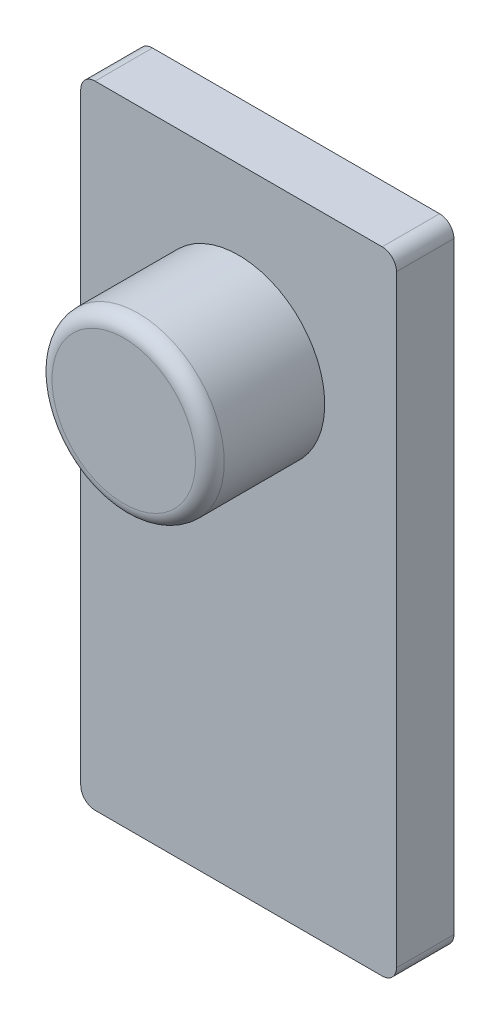
ISO-10303-21;
HEADER;
FILE_DESCRIPTION(('STEP AP214'),'2;1');
FILE_NAME('part.step','',(''),(''),'','','');
FILE_SCHEMA(('AUTOMOTIVE_DESIGN { 1 0 10303 214 1 1 1 1 }'));
ENDSEC;
DATA;
#1=APPLICATION_CONTEXT('core data for automotive mechanical design processes');
#2=APPLICATION_PROTOCOL_DEFINITION('international standard','automotive_design',2000,#1);
#3=PRODUCT_CONTEXT('',#1,'mechanical');
#4=PRODUCT('Part','Part','',(#3));
#5=PRODUCT_RELATED_PRODUCT_CATEGORY('part','',(#4));
#6=PRODUCT_DEFINITION_FORMATION('','',#4);
#7=PRODUCT_DEFINITION_CONTEXT('part definition',#1,'design');
#8=PRODUCT_DEFINITION('design','',#6,#7);
#9=PRODUCT_DEFINITION_SHAPE('','',#8);
#10=(LENGTH_UNIT() NAMED_UNIT(*) SI_UNIT(.MILLI.,.METRE.));
#11=(NAMED_UNIT(*) PLANE_ANGLE_UNIT() SI_UNIT($,.RADIAN.));
#12=(NAMED_UNIT(*) SI_UNIT($,.STERADIAN.) SOLID_ANGLE_UNIT());
#13=UNCERTAINTY_MEASURE_WITH_UNIT(LENGTH_MEASURE(1.E-05),#10,'distance_accuracy_value','');
#14=(GEOMETRIC_REPRESENTATION_CONTEXT(3) GLOBAL_UNCERTAINTY_ASSIGNED_CONTEXT((#13)) GLOBAL_UNIT_ASSIGNED_CONTEXT((#10,
#11,#12)) REPRESENTATION_CONTEXT('',''));
#15=CARTESIAN_POINT('',(0.,0.,0.));
#16=DIRECTION('',(0.,0.,1.));
#17=DIRECTION('',(1.,0.,0.));
#18=AXIS2_PLACEMENT_3D('',#15,#16,#17);
#19=CARTESIAN_POINT('',(-11.5,-11.,2.));
#20=DIRECTION('',(1.,0.,0.));
#21=DIRECTION('',(0.,0.,-1.));
#22=AXIS2_PLACEMENT_3D('',#19,#20,#21);
#23=PLANE('',#22);
#24=DIRECTION('',(0.,-1.,0.));
#25=VECTOR('',#24,1.);
#26=CARTESIAN_POINT('',(-11.5,-11.,0.));
#27=LINE('',#26,#25);
#28=CARTESIAN_POINT('',(-11.5,10.5,0.));
#29=VERTEX_POINT('',#28);
#30=CARTESIAN_POINT('',(-11.5,-10.5,0.));
#31=VERTEX_POINT('',#30);
#32=EDGE_CURVE('E146',#29,#31,#27,.T.);
#33=ORIENTED_EDGE('',*,*,#32,.T.);
#34=DIRECTION('',(0.,0.,-1.));
#35=VECTOR('',#34,1.);
#36=CARTESIAN_POINT('',(-11.5,-10.5,2.));
#37=LINE('',#36,#35);
#38=CARTESIAN_POINT('',(-11.5,-10.5,2.));
#39=VERTEX_POINT('',#38);
#40=EDGE_CURVE('E191',#31,#39,#37,.F.);
#41=ORIENTED_EDGE('',*,*,#40,.T.);
#42=DIRECTION('',(0.,-1.,0.));
#43=VECTOR('',#42,1.);
#44=CARTESIAN_POINT('',(-11.5,-11.,2.));
#45=LINE('',#44,#43);
#46=CARTESIAN_POINT('',(-11.5,10.5,2.));
#47=VERTEX_POINT('',#46);
#48=EDGE_CURVE('E144',#47,#39,#45,.T.);
#49=ORIENTED_EDGE('',*,*,#48,.F.);
#50=DIRECTION('',(0.,0.,-1.));
#51=VECTOR('',#50,1.);
#52=CARTESIAN_POINT('',(-11.5,10.5,2.));
#53=LINE('',#52,#51);
#54=EDGE_CURVE('E187',#47,#29,#53,.T.);
#55=ORIENTED_EDGE('',*,*,#54,.T.);
#56=EDGE_LOOP('',(#33,#41,#49,#55));
#57=FACE_BOUND('',#56,.T.);
#58=ADVANCED_FACE('F43',(#57),#23,.F.);
#59=CARTESIAN_POINT('',(-11.5,-11.,2.));
#60=DIRECTION('',(0.,1.,0.));
#61=DIRECTION('',(0.,0.,1.));
#62=AXIS2_PLACEMENT_3D('',#59,#60,#61);
#63=PLANE('',#62);
#64=DIRECTION('',(1.,0.,0.));
#65=VECTOR('',#64,1.);
#66=CARTESIAN_POINT('',(-11.5,-11.,0.));
#67=LINE('',#66,#65);
#68=CARTESIAN_POINT('',(-11.,-11.,0.));
#69=VERTEX_POINT('',#68);
#70=CARTESIAN_POINT('',(-1.,-11.,0.));
#71=VERTEX_POINT('',#70);
#72=EDGE_CURVE('E140',#69,#71,#67,.T.);
#73=ORIENTED_EDGE('',*,*,#72,.T.);
#74=DIRECTION('',(0.,0.,-1.));
#75=VECTOR('',#74,1.);
#76=CARTESIAN_POINT('',(-1.,-11.,2.));
#77=LINE('',#76,#75);
#78=CARTESIAN_POINT('',(-1.,-11.,2.));
#79=VERTEX_POINT('',#78);
#80=EDGE_CURVE('E115',#71,#79,#77,.F.);
#81=ORIENTED_EDGE('',*,*,#80,.T.);
#82=DIRECTION('',(1.,0.,0.));
#83=VECTOR('',#82,1.);
#84=CARTESIAN_POINT('',(-11.5,-11.,2.));
#85=LINE('',#84,#83);
#86=CARTESIAN_POINT('',(-11.,-11.,2.));
#87=VERTEX_POINT('',#86);
#88=EDGE_CURVE('E198',#87,#79,#85,.T.);
#89=ORIENTED_EDGE('',*,*,#88,.F.);
#90=DIRECTION('',(0.,0.,-1.));
#91=VECTOR('',#90,1.);
#92=CARTESIAN_POINT('',(-11.,-11.,2.));
#93=LINE('',#92,#91);
#94=EDGE_CURVE('E121',#87,#69,#93,.T.);
#95=ORIENTED_EDGE('',*,*,#94,.T.);
#96=EDGE_LOOP('',(#73,#81,#89,#95));
#97=FACE_BOUND('',#96,.T.);
#98=ADVANCED_FACE('F219',(#97),#63,.F.);
#99=CARTESIAN_POINT('',(-0.5,-11.,2.));
#100=DIRECTION('',(-1.,0.,0.));
#101=DIRECTION('',(0.,0.,1.));
#102=AXIS2_PLACEMENT_3D('',#99,#100,#101);
#103=PLANE('',#102);
#104=DIRECTION('',(0.,1.,0.));
#105=VECTOR('',#104,1.);
#106=CARTESIAN_POINT('',(-0.5,-11.,2.));
#107=LINE('',#106,#105);
#108=CARTESIAN_POINT('',(-0.5,-10.5,2.));
#109=VERTEX_POINT('',#108);
#110=CARTESIAN_POINT('',(-0.5,10.5,2.));
#111=VERTEX_POINT('',#110);
#112=EDGE_CURVE('E130',#109,#111,#107,.T.);
#113=ORIENTED_EDGE('',*,*,#112,.F.);
#114=DIRECTION('',(0.,0.,-1.));
#115=VECTOR('',#114,1.);
#116=CARTESIAN_POINT('',(-0.5,-10.5,2.));
#117=LINE('',#116,#115);
#118=CARTESIAN_POINT('',(-0.5,-10.5,0.));
#119=VERTEX_POINT('',#118);
#120=EDGE_CURVE('E114',#109,#119,#117,.T.);
#121=ORIENTED_EDGE('',*,*,#120,.T.);
#122=DIRECTION('',(0.,1.,0.));
#123=VECTOR('',#122,1.);
#124=CARTESIAN_POINT('',(-0.5,-11.,0.));
#125=LINE('',#124,#123);
#126=CARTESIAN_POINT('',(-0.5,10.5,0.));
#127=VERTEX_POINT('',#126);
#128=EDGE_CURVE('E128',#119,#127,#125,.T.);
#129=ORIENTED_EDGE('',*,*,#128,.T.);
#130=DIRECTION('',(0.,0.,-1.));
#131=VECTOR('',#130,1.);
#132=CARTESIAN_POINT('',(-0.5,10.5,2.));
#133=LINE('',#132,#131);
#134=EDGE_CURVE('E133',#127,#111,#133,.F.);
#135=ORIENTED_EDGE('',*,*,#134,.T.);
#136=EDGE_LOOP('',(#113,#121,#129,#135));
#137=FACE_BOUND('',#136,.T.);
#138=ADVANCED_FACE('F127',(#137),#103,.F.);
#139=CARTESIAN_POINT('',(-11.5,11.,2.));
#140=DIRECTION('',(0.,-1.,0.));
#141=DIRECTION('',(0.,0.,-1.));
#142=AXIS2_PLACEMENT_3D('',#139,#140,#141);
#143=PLANE('',#142);
#144=DIRECTION('',(-1.,0.,0.));
#145=VECTOR('',#144,1.);
#146=CARTESIAN_POINT('',(-11.5,11.,2.));
#147=LINE('',#146,#145);
#148=CARTESIAN_POINT('',(-1.,11.,2.));
#149=VERTEX_POINT('',#148);
#150=CARTESIAN_POINT('',(-11.,11.,2.));
#151=VERTEX_POINT('',#150);
#152=EDGE_CURVE('E155',#149,#151,#147,.T.);
#153=ORIENTED_EDGE('',*,*,#152,.F.);
#154=DIRECTION('',(0.,0.,-1.));
#155=VECTOR('',#154,1.);
#156=CARTESIAN_POINT('',(-1.,11.,2.));
#157=LINE('',#156,#155);
#158=CARTESIAN_POINT('',(-1.,11.,0.));
#159=VERTEX_POINT('',#158);
#160=EDGE_CURVE('E11',#149,#159,#157,.T.);
#161=ORIENTED_EDGE('',*,*,#160,.T.);
#162=DIRECTION('',(-1.,0.,0.));
#163=VECTOR('',#162,1.);
#164=CARTESIAN_POINT('',(-11.5,11.,0.));
#165=LINE('',#164,#163);
#166=CARTESIAN_POINT('',(-11.,11.,0.));
#167=VERTEX_POINT('',#166);
#168=EDGE_CURVE('E139',#159,#167,#165,.T.);
#169=ORIENTED_EDGE('',*,*,#168,.T.);
#170=DIRECTION('',(0.,0.,-1.));
#171=VECTOR('',#170,1.);
#172=CARTESIAN_POINT('',(-11.,11.,2.));
#173=LINE('',#172,#171);
#174=EDGE_CURVE('E52',#167,#151,#173,.F.);
#175=ORIENTED_EDGE('',*,*,#174,.T.);
#176=EDGE_LOOP('',(#153,#161,#169,#175));
#177=FACE_BOUND('',#176,.T.);
#178=ADVANCED_FACE('F226',(#177),#143,.F.);
#179=CARTESIAN_POINT('',(0.,0.,2.));
#180=DIRECTION('',(0.,0.,-1.));
#181=DIRECTION('',(-1.,0.,0.));
#182=AXIS2_PLACEMENT_3D('',#179,#180,#181);
#183=PLANE('',#182);
#184=CARTESIAN_POINT('',(-6.,5.25,2.));
#185=DIRECTION('',(0.,0.,-1.));
#186=DIRECTION('',(-1.,0.,0.));
#187=AXIS2_PLACEMENT_3D('',#184,#185,#186);
#188=CIRCLE('',#187,3.);
#189=CARTESIAN_POINT('',(-9.,5.25,2.));
#190=VERTEX_POINT('',#189);
#191=EDGE_CURVE('E150',#190,#190,#188,.F.);
#192=ORIENTED_EDGE('',*,*,#191,.F.);
#193=EDGE_LOOP('',(#192));
#194=FACE_BOUND('',#193,.T.);
#195=ORIENTED_EDGE('',*,*,#88,.T.);
#196=CARTESIAN_POINT('',(-1.,-10.5,2.));
#197=DIRECTION('',(0.,0.,-1.));
#198=DIRECTION('',(-1.,0.,0.));
#199=AXIS2_PLACEMENT_3D('',#196,#197,#198);
#200=CIRCLE('',#199,0.5);
#201=EDGE_CURVE('E184',#79,#109,#200,.F.);
#202=ORIENTED_EDGE('',*,*,#201,.T.);
#203=ORIENTED_EDGE('',*,*,#112,.T.);
#204=CARTESIAN_POINT('',(-1.,10.5,2.));
#205=DIRECTION('',(0.,0.,-1.));
#206=DIRECTION('',(-1.,0.,0.));
#207=AXIS2_PLACEMENT_3D('',#204,#205,#206);
#208=CIRCLE('',#207,0.5);
#209=EDGE_CURVE('E65',#111,#149,#208,.F.);
#210=ORIENTED_EDGE('',*,*,#209,.T.);
#211=ORIENTED_EDGE('',*,*,#152,.T.);
#212=CARTESIAN_POINT('',(-11.,10.5,2.));
#213=DIRECTION('',(0.,0.,-1.));
#214=DIRECTION('',(-1.,0.,0.));
#215=AXIS2_PLACEMENT_3D('',#212,#213,#214);
#216=CIRCLE('',#215,0.5);
#217=EDGE_CURVE('E176',#151,#47,#216,.F.);
#218=ORIENTED_EDGE('',*,*,#217,.T.);
#219=ORIENTED_EDGE('',*,*,#48,.T.);
#220=CARTESIAN_POINT('',(-11.,-10.5,2.));
#221=DIRECTION('',(0.,0.,-1.));
#222=DIRECTION('',(-1.,0.,0.));
#223=AXIS2_PLACEMENT_3D('',#220,#221,#222);
#224=CIRCLE('',#223,0.5);
#225=EDGE_CURVE('E181',#39,#87,#224,.F.);
#226=ORIENTED_EDGE('',*,*,#225,.T.);
#227=EDGE_LOOP('',(#195,#202,#203,#210,#211,#218,#219,#226));
#228=FACE_BOUND('',#227,.T.);
#229=ADVANCED_FACE('F217',(#194,#228),#183,.F.);
#230=CARTESIAN_POINT('',(0.,0.,0.));
#231=DIRECTION('',(0.,0.,-1.));
#232=DIRECTION('',(-1.,0.,0.));
#233=AXIS2_PLACEMENT_3D('',#230,#231,#232);
#234=PLANE('',#233);
#235=ORIENTED_EDGE('',*,*,#128,.F.);
#236=CARTESIAN_POINT('',(-1.,-10.5,0.));
#237=DIRECTION('',(0.,0.,-1.));
#238=DIRECTION('',(-1.,0.,0.));
#239=AXIS2_PLACEMENT_3D('',#236,#237,#238);
#240=CIRCLE('',#239,0.5);
#241=EDGE_CURVE('E110',#119,#71,#240,.T.);
#242=ORIENTED_EDGE('',*,*,#241,.T.);
#243=ORIENTED_EDGE('',*,*,#72,.F.);
#244=CARTESIAN_POINT('',(-11.,-10.5,0.));
#245=DIRECTION('',(0.,0.,-1.));
#246=DIRECTION('',(-1.,0.,0.));
#247=AXIS2_PLACEMENT_3D('',#244,#245,#246);
#248=CIRCLE('',#247,0.5);
#249=EDGE_CURVE('E122',#69,#31,#248,.T.);
#250=ORIENTED_EDGE('',*,*,#249,.T.);
#251=ORIENTED_EDGE('',*,*,#32,.F.);
#252=CARTESIAN_POINT('',(-11.,10.5,0.));
#253=DIRECTION('',(0.,0.,-1.));
#254=DIRECTION('',(-1.,0.,0.));
#255=AXIS2_PLACEMENT_3D('',#252,#253,#254);
#256=CIRCLE('',#255,0.5);
#257=EDGE_CURVE('E132',#29,#167,#256,.T.);
#258=ORIENTED_EDGE('',*,*,#257,.T.);
#259=ORIENTED_EDGE('',*,*,#168,.F.);
#260=CARTESIAN_POINT('',(-1.,10.5,0.));
#261=DIRECTION('',(0.,0.,-1.));
#262=DIRECTION('',(-1.,0.,0.));
#263=AXIS2_PLACEMENT_3D('',#260,#261,#262);
#264=CIRCLE('',#263,0.5);
#265=EDGE_CURVE('E137',#159,#127,#264,.T.);
#266=ORIENTED_EDGE('',*,*,#265,.T.);
#267=EDGE_LOOP('',(#235,#242,#243,#250,#251,#258,#259,#266));
#268=FACE_BOUND('',#267,.T.);
#269=ADVANCED_FACE('F135',(#268),#234,.T.);
#270=CARTESIAN_POINT('',(-6.,5.25,6.));
#271=DIRECTION('',(0.,0.,-1.));
#272=DIRECTION('',(-1.,0.,0.));
#273=AXIS2_PLACEMENT_3D('',#270,#271,#272);
#274=CYLINDRICAL_SURFACE('',#273,3.);
#275=CARTESIAN_POINT('',(-6.,5.25,5.5));
#276=DIRECTION('',(0.,0.,1.));
#277=DIRECTION('',(1.,0.,0.));
#278=AXIS2_PLACEMENT_3D('',#275,#276,#277);
#279=CIRCLE('',#278,3.);
#280=CARTESIAN_POINT('',(-3.,5.25,5.5));
#281=VERTEX_POINT('',#280);
#282=EDGE_CURVE('E159',#281,#281,#279,.F.);
#283=ORIENTED_EDGE('',*,*,#282,.T.);
#284=EDGE_LOOP('',(#283));
#285=FACE_BOUND('',#284,.T.);
#286=ORIENTED_EDGE('',*,*,#191,.T.);
#287=EDGE_LOOP('',(#286));
#288=FACE_BOUND('',#287,.T.);
#289=ADVANCED_FACE('F256',(#285,#288),#274,.T.);
#290=CARTESIAN_POINT('',(-6.,5.25,6.));
#291=DIRECTION('',(0.,0.,1.));
#292=DIRECTION('',(1.,0.,0.));
#293=AXIS2_PLACEMENT_3D('',#290,#291,#292);
#294=PLANE('',#293);
#295=CARTESIAN_POINT('',(-6.,5.25,6.));
#296=DIRECTION('',(0.,0.,1.));
#297=DIRECTION('',(1.,0.,0.));
#298=AXIS2_PLACEMENT_3D('',#295,#296,#297);
#299=CIRCLE('',#298,2.5);
#300=CARTESIAN_POINT('',(-3.5,5.25,6.));
#301=VERTEX_POINT('',#300);
#302=EDGE_CURVE('E154',#301,#301,#299,.T.);
#303=ORIENTED_EDGE('',*,*,#302,.T.);
#304=EDGE_LOOP('',(#303));
#305=FACE_BOUND('',#304,.T.);
#306=ADVANCED_FACE('F234',(#305),#294,.T.);
#307=CARTESIAN_POINT('',(-6.,5.25,5.5));
#308=DIRECTION('',(0.,0.,1.));
#309=DIRECTION('',(1.,0.,0.));
#310=AXIS2_PLACEMENT_3D('',#307,#308,#309);
#311=TOROIDAL_SURFACE('',#310,2.5,0.5);
#312=ORIENTED_EDGE('',*,*,#282,.F.);
#313=EDGE_LOOP('',(#312));
#314=FACE_BOUND('',#313,.T.);
#315=ORIENTED_EDGE('',*,*,#302,.F.);
#316=EDGE_LOOP('',(#315));
#317=FACE_BOUND('',#316,.T.);
#318=ADVANCED_FACE('F231',(#314,#317),#311,.T.);
#319=CARTESIAN_POINT('',(-1.,-10.5,2.));
#320=DIRECTION('',(0.,0.,-1.));
#321=DIRECTION('',(-1.,0.,0.));
#322=AXIS2_PLACEMENT_3D('',#319,#320,#321);
#323=CYLINDRICAL_SURFACE('',#322,0.5);
#324=ORIENTED_EDGE('',*,*,#201,.F.);
#325=ORIENTED_EDGE('',*,*,#80,.F.);
#326=ORIENTED_EDGE('',*,*,#241,.F.);
#327=ORIENTED_EDGE('',*,*,#120,.F.);
#328=EDGE_LOOP('',(#324,#325,#326,#327));
#329=FACE_BOUND('',#328,.T.);
#330=ADVANCED_FACE('F113',(#329),#323,.T.);
#331=CARTESIAN_POINT('',(-11.,-10.5,2.));
#332=DIRECTION('',(0.,0.,-1.));
#333=DIRECTION('',(-1.,0.,0.));
#334=AXIS2_PLACEMENT_3D('',#331,#332,#333);
#335=CYLINDRICAL_SURFACE('',#334,0.5);
#336=ORIENTED_EDGE('',*,*,#225,.F.);
#337=ORIENTED_EDGE('',*,*,#40,.F.);
#338=ORIENTED_EDGE('',*,*,#249,.F.);
#339=ORIENTED_EDGE('',*,*,#94,.F.);
#340=EDGE_LOOP('',(#336,#337,#338,#339));
#341=FACE_BOUND('',#340,.T.);
#342=ADVANCED_FACE('F214',(#341),#335,.T.);
#343=CARTESIAN_POINT('',(-1.,10.5,2.));
#344=DIRECTION('',(0.,0.,-1.));
#345=DIRECTION('',(-1.,0.,0.));
#346=AXIS2_PLACEMENT_3D('',#343,#344,#345);
#347=CYLINDRICAL_SURFACE('',#346,0.5);
#348=ORIENTED_EDGE('',*,*,#209,.F.);
#349=ORIENTED_EDGE('',*,*,#134,.F.);
#350=ORIENTED_EDGE('',*,*,#265,.F.);
#351=ORIENTED_EDGE('',*,*,#160,.F.);
#352=EDGE_LOOP('',(#348,#349,#350,#351));
#353=FACE_BOUND('',#352,.T.);
#354=ADVANCED_FACE('F239',(#353),#347,.T.);
#355=CARTESIAN_POINT('',(-11.,10.5,2.));
#356=DIRECTION('',(0.,0.,-1.));
#357=DIRECTION('',(-1.,0.,0.));
#358=AXIS2_PLACEMENT_3D('',#355,#356,#357);
#359=CYLINDRICAL_SURFACE('',#358,0.5);
#360=ORIENTED_EDGE('',*,*,#217,.F.);
#361=ORIENTED_EDGE('',*,*,#174,.F.);
#362=ORIENTED_EDGE('',*,*,#257,.F.);
#363=ORIENTED_EDGE('',*,*,#54,.F.);
#364=EDGE_LOOP('',(#360,#361,#362,#363));
#365=FACE_BOUND('',#364,.T.);
#366=ADVANCED_FACE('F45',(#365),#359,.T.);
#367=CLOSED_SHELL('',(#58,#98,#138,#178,#229,#269,#289,#306,#318,#330,#342,#354,#366));
#368=MANIFOLD_SOLID_BREP('B2',#367);
#369=ADVANCED_BREP_SHAPE_REPRESENTATION('',(#18,#368),#14);
#370=SHAPE_DEFINITION_REPRESENTATION(#9,#369);
ENDSEC;
END-ISO-10303-21;
